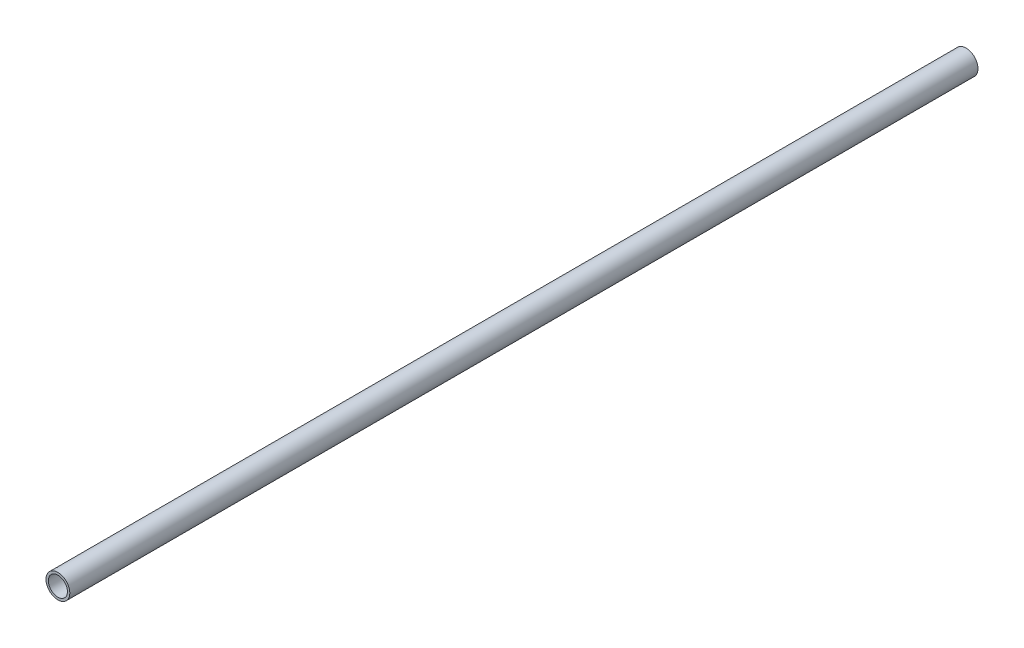
ISO-10303-21;
HEADER;
FILE_DESCRIPTION(('STEP AP214'),'2;1');
FILE_NAME('part.step','',(''),(''),'','','');
FILE_SCHEMA(('AUTOMOTIVE_DESIGN { 1 0 10303 214 1 1 1 1 }'));
ENDSEC;
DATA;
#1=APPLICATION_CONTEXT('core data for automotive mechanical design processes');
#2=APPLICATION_PROTOCOL_DEFINITION('international standard','automotive_design',2000,#1);
#3=PRODUCT_CONTEXT('',#1,'mechanical');
#4=PRODUCT('Part','Part','',(#3));
#5=PRODUCT_RELATED_PRODUCT_CATEGORY('part','',(#4));
#6=PRODUCT_DEFINITION_FORMATION('','',#4);
#7=PRODUCT_DEFINITION_CONTEXT('part definition',#1,'design');
#8=PRODUCT_DEFINITION('design','',#6,#7);
#9=PRODUCT_DEFINITION_SHAPE('','',#8);
#10=(LENGTH_UNIT() NAMED_UNIT(*) SI_UNIT(.MILLI.,.METRE.));
#11=(NAMED_UNIT(*) PLANE_ANGLE_UNIT() SI_UNIT($,.RADIAN.));
#12=(NAMED_UNIT(*) SI_UNIT($,.STERADIAN.) SOLID_ANGLE_UNIT());
#13=UNCERTAINTY_MEASURE_WITH_UNIT(LENGTH_MEASURE(1.E-05),#10,'distance_accuracy_value','');
#14=(GEOMETRIC_REPRESENTATION_CONTEXT(3) GLOBAL_UNCERTAINTY_ASSIGNED_CONTEXT((#13)) GLOBAL_UNIT_ASSIGNED_CONTEXT((#10,
#11,#12)) REPRESENTATION_CONTEXT('',''));
#15=CARTESIAN_POINT('',(0.,0.,0.));
#16=DIRECTION('',(0.,0.,1.));
#17=DIRECTION('',(1.,0.,0.));
#18=AXIS2_PLACEMENT_3D('',#15,#16,#17);
#19=CARTESIAN_POINT('',(0.,0.,190.5));
#20=DIRECTION('',(0.,0.,1.));
#21=DIRECTION('',(1.,0.,0.));
#22=AXIS2_PLACEMENT_3D('',#19,#20,#21);
#23=PLANE('',#22);
#24=CARTESIAN_POINT('',(0.,0.,190.5));
#25=DIRECTION('',(0.,0.,1.));
#26=DIRECTION('',(1.,0.,0.));
#27=AXIS2_PLACEMENT_3D('',#24,#25,#26);
#28=CIRCLE('',#27,5.);
#29=CARTESIAN_POINT('',(5.,0.,190.5));
#30=VERTEX_POINT('',#29);
#31=EDGE_CURVE('E10',#30,#30,#28,.T.);
#32=ORIENTED_EDGE('',*,*,#31,.T.);
#33=EDGE_LOOP('',(#32));
#34=FACE_BOUND('',#33,.T.);
#35=CARTESIAN_POINT('',(0.,0.,190.5));
#36=DIRECTION('',(0.,0.,1.));
#37=DIRECTION('',(1.,0.,0.));
#38=AXIS2_PLACEMENT_3D('',#35,#36,#37);
#39=CIRCLE('',#38,4.);
#40=CARTESIAN_POINT('',(4.,0.,190.5));
#41=VERTEX_POINT('',#40);
#42=EDGE_CURVE('E44',#41,#41,#39,.T.);
#43=ORIENTED_EDGE('',*,*,#42,.F.);
#44=EDGE_LOOP('',(#43));
#45=FACE_BOUND('',#44,.T.);
#46=ADVANCED_FACE('F33',(#34,#45),#23,.T.);
#47=CARTESIAN_POINT('',(0.,0.,-190.5));
#48=DIRECTION('',(0.,0.,1.));
#49=DIRECTION('',(1.,0.,0.));
#50=AXIS2_PLACEMENT_3D('',#47,#48,#49);
#51=PLANE('',#50);
#52=CARTESIAN_POINT('',(0.,0.,-190.5));
#53=DIRECTION('',(0.,0.,1.));
#54=DIRECTION('',(1.,0.,0.));
#55=AXIS2_PLACEMENT_3D('',#52,#53,#54);
#56=CIRCLE('',#55,5.);
#57=CARTESIAN_POINT('',(5.,0.,-190.5));
#58=VERTEX_POINT('',#57);
#59=EDGE_CURVE('E37',#58,#58,#56,.T.);
#60=ORIENTED_EDGE('',*,*,#59,.F.);
#61=EDGE_LOOP('',(#60));
#62=FACE_BOUND('',#61,.T.);
#63=CARTESIAN_POINT('',(0.,0.,-190.5));
#64=DIRECTION('',(0.,0.,1.));
#65=DIRECTION('',(1.,0.,0.));
#66=AXIS2_PLACEMENT_3D('',#63,#64,#65);
#67=CIRCLE('',#66,4.);
#68=CARTESIAN_POINT('',(4.,0.,-190.5));
#69=VERTEX_POINT('',#68);
#70=EDGE_CURVE('E46',#69,#69,#67,.T.);
#71=ORIENTED_EDGE('',*,*,#70,.T.);
#72=EDGE_LOOP('',(#71));
#73=FACE_BOUND('',#72,.T.);
#74=ADVANCED_FACE('F56',(#62,#73),#51,.F.);
#75=CARTESIAN_POINT('',(0.,0.,190.5));
#76=DIRECTION('',(0.,0.,-1.));
#77=DIRECTION('',(-1.,0.,0.));
#78=AXIS2_PLACEMENT_3D('',#75,#76,#77);
#79=CYLINDRICAL_SURFACE('',#78,5.);
#80=ORIENTED_EDGE('',*,*,#31,.F.);
#81=EDGE_LOOP('',(#80));
#82=FACE_BOUND('',#81,.T.);
#83=ORIENTED_EDGE('',*,*,#59,.T.);
#84=EDGE_LOOP('',(#83));
#85=FACE_BOUND('',#84,.T.);
#86=ADVANCED_FACE('F35',(#82,#85),#79,.T.);
#87=CARTESIAN_POINT('',(0.,0.,190.5));
#88=DIRECTION('',(0.,0.,-1.));
#89=DIRECTION('',(-1.,0.,0.));
#90=AXIS2_PLACEMENT_3D('',#87,#88,#89);
#91=CYLINDRICAL_SURFACE('',#90,4.);
#92=ORIENTED_EDGE('',*,*,#42,.T.);
#93=EDGE_LOOP('',(#92));
#94=FACE_BOUND('',#93,.T.);
#95=ORIENTED_EDGE('',*,*,#70,.F.);
#96=EDGE_LOOP('',(#95));
#97=FACE_BOUND('',#96,.T.);
#98=ADVANCED_FACE('F52',(#94,#97),#91,.F.);
#99=CLOSED_SHELL('',(#46,#74,#86,#98));
#100=MANIFOLD_SOLID_BREP('B2',#99);
#101=ADVANCED_BREP_SHAPE_REPRESENTATION('',(#18,#100),#14);
#102=SHAPE_DEFINITION_REPRESENTATION(#9,#101);
ENDSEC;
END-ISO-10303-21;
